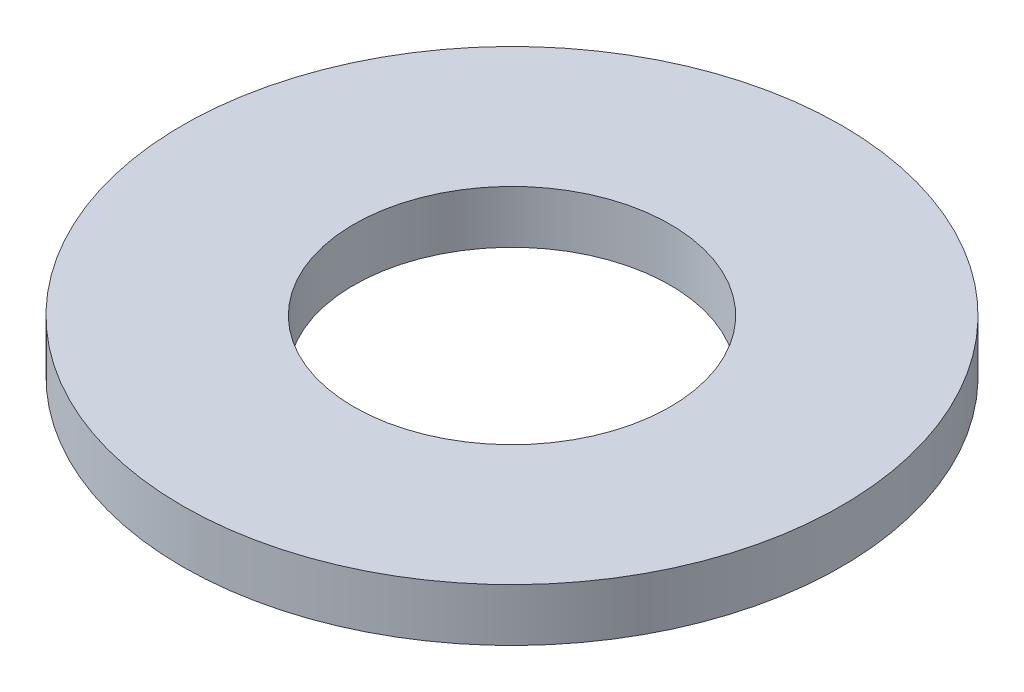
ISO-10303-21;
HEADER;
FILE_DESCRIPTION(('STEP AP214'),'2;1');
FILE_NAME('part.step','',(''),(''),'','','');
FILE_SCHEMA(('AUTOMOTIVE_DESIGN { 1 0 10303 214 1 1 1 1 }'));
ENDSEC;
DATA;
#1=APPLICATION_CONTEXT('core data for automotive mechanical design processes');
#2=APPLICATION_PROTOCOL_DEFINITION('international standard','automotive_design',2000,#1);
#3=PRODUCT_CONTEXT('',#1,'mechanical');
#4=PRODUCT('Part','Part','',(#3));
#5=PRODUCT_RELATED_PRODUCT_CATEGORY('part','',(#4));
#6=PRODUCT_DEFINITION_FORMATION('','',#4);
#7=PRODUCT_DEFINITION_CONTEXT('part definition',#1,'design');
#8=PRODUCT_DEFINITION('design','',#6,#7);
#9=PRODUCT_DEFINITION_SHAPE('','',#8);
#10=(LENGTH_UNIT() NAMED_UNIT(*) SI_UNIT(.MILLI.,.METRE.));
#11=(NAMED_UNIT(*) PLANE_ANGLE_UNIT() SI_UNIT($,.RADIAN.));
#12=(NAMED_UNIT(*) SI_UNIT($,.STERADIAN.) SOLID_ANGLE_UNIT());
#13=UNCERTAINTY_MEASURE_WITH_UNIT(LENGTH_MEASURE(1.E-05),#10,'distance_accuracy_value','');
#14=(GEOMETRIC_REPRESENTATION_CONTEXT(3) GLOBAL_UNCERTAINTY_ASSIGNED_CONTEXT((#13)) GLOBAL_UNIT_ASSIGNED_CONTEXT((#10,
#11,#12)) REPRESENTATION_CONTEXT('',''));
#15=CARTESIAN_POINT('',(0.,0.,0.));
#16=DIRECTION('',(0.,0.,1.));
#17=DIRECTION('',(1.,0.,0.));
#18=AXIS2_PLACEMENT_3D('',#15,#16,#17);
#19=CARTESIAN_POINT('',(0.,0.5,0.));
#20=DIRECTION('',(0.,1.,0.));
#21=DIRECTION('',(0.,0.,1.));
#22=AXIS2_PLACEMENT_3D('',#19,#20,#21);
#23=PLANE('',#22);
#24=CARTESIAN_POINT('',(0.,0.5,0.));
#25=DIRECTION('',(0.,1.,0.));
#26=DIRECTION('',(0.,0.,1.));
#27=AXIS2_PLACEMENT_3D('',#24,#25,#26);
#28=CIRCLE('',#27,6.25);
#29=CARTESIAN_POINT('',(0.,0.5,6.25));
#30=VERTEX_POINT('',#29);
#31=EDGE_CURVE('E10',#30,#30,#28,.T.);
#32=ORIENTED_EDGE('',*,*,#31,.T.);
#33=EDGE_LOOP('',(#32));
#34=FACE_BOUND('',#33,.T.);
#35=CARTESIAN_POINT('',(0.,0.5,0.));
#36=DIRECTION('',(0.,1.,0.));
#37=DIRECTION('',(0.,0.,1.));
#38=AXIS2_PLACEMENT_3D('',#35,#36,#37);
#39=CIRCLE('',#38,3.);
#40=CARTESIAN_POINT('',(0.,0.5,3.));
#41=VERTEX_POINT('',#40);
#42=EDGE_CURVE('E50',#41,#41,#39,.T.);
#43=ORIENTED_EDGE('',*,*,#42,.F.);
#44=EDGE_LOOP('',(#43));
#45=FACE_BOUND('',#44,.T.);
#46=ADVANCED_FACE('F39',(#34,#45),#23,.T.);
#47=CARTESIAN_POINT('',(0.,-0.5,0.));
#48=DIRECTION('',(0.,1.,0.));
#49=DIRECTION('',(0.,0.,1.));
#50=AXIS2_PLACEMENT_3D('',#47,#48,#49);
#51=PLANE('',#50);
#52=CARTESIAN_POINT('',(0.,-0.5,0.));
#53=DIRECTION('',(0.,1.,0.));
#54=DIRECTION('',(0.,0.,1.));
#55=AXIS2_PLACEMENT_3D('',#52,#53,#54);
#56=CIRCLE('',#55,6.25);
#57=CARTESIAN_POINT('',(0.,-0.5,6.25));
#58=VERTEX_POINT('',#57);
#59=EDGE_CURVE('E43',#58,#58,#56,.T.);
#60=ORIENTED_EDGE('',*,*,#59,.F.);
#61=EDGE_LOOP('',(#60));
#62=FACE_BOUND('',#61,.T.);
#63=CARTESIAN_POINT('',(0.,-0.5,0.));
#64=DIRECTION('',(0.,1.,0.));
#65=DIRECTION('',(0.,0.,1.));
#66=AXIS2_PLACEMENT_3D('',#63,#64,#65);
#67=CIRCLE('',#66,3.);
#68=CARTESIAN_POINT('',(0.,-0.5,3.));
#69=VERTEX_POINT('',#68);
#70=EDGE_CURVE('E52',#69,#69,#67,.T.);
#71=ORIENTED_EDGE('',*,*,#70,.T.);
#72=EDGE_LOOP('',(#71));
#73=FACE_BOUND('',#72,.T.);
#74=ADVANCED_FACE('F62',(#62,#73),#51,.F.);
#75=CARTESIAN_POINT('',(0.,0.5,0.));
#76=DIRECTION('',(0.,-1.,0.));
#77=DIRECTION('',(0.,0.,-1.));
#78=AXIS2_PLACEMENT_3D('',#75,#76,#77);
#79=CYLINDRICAL_SURFACE('',#78,6.25);
#80=ORIENTED_EDGE('',*,*,#31,.F.);
#81=EDGE_LOOP('',(#80));
#82=FACE_BOUND('',#81,.T.);
#83=ORIENTED_EDGE('',*,*,#59,.T.);
#84=EDGE_LOOP('',(#83));
#85=FACE_BOUND('',#84,.T.);
#86=ADVANCED_FACE('F41',(#82,#85),#79,.T.);
#87=CARTESIAN_POINT('',(0.,0.5,0.));
#88=DIRECTION('',(0.,-1.,0.));
#89=DIRECTION('',(0.,0.,-1.));
#90=AXIS2_PLACEMENT_3D('',#87,#88,#89);
#91=CYLINDRICAL_SURFACE('',#90,3.);
#92=ORIENTED_EDGE('',*,*,#42,.T.);
#93=EDGE_LOOP('',(#92));
#94=FACE_BOUND('',#93,.T.);
#95=ORIENTED_EDGE('',*,*,#70,.F.);
#96=EDGE_LOOP('',(#95));
#97=FACE_BOUND('',#96,.T.);
#98=ADVANCED_FACE('F58',(#94,#97),#91,.F.);
#99=CLOSED_SHELL('',(#46,#74,#86,#98));
#100=MANIFOLD_SOLID_BREP('B2',#99);
#101=ADVANCED_BREP_SHAPE_REPRESENTATION('',(#18,#100),#14);
#102=SHAPE_DEFINITION_REPRESENTATION(#9,#101);
ENDSEC;
END-ISO-10303-21;
